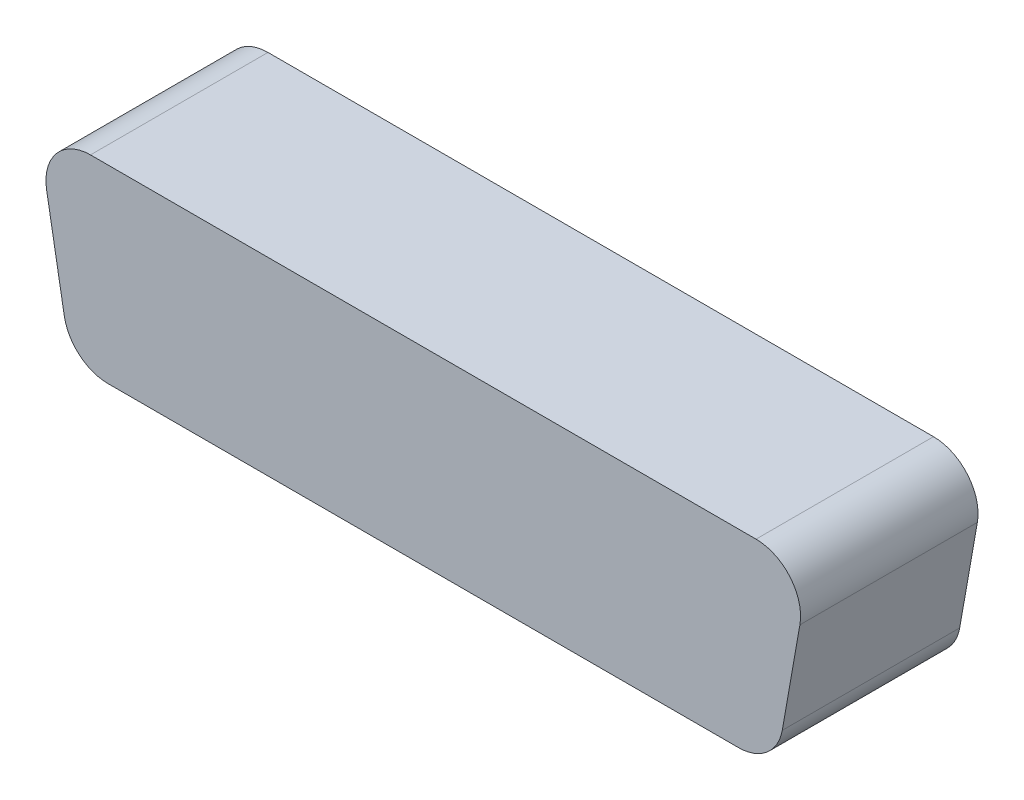
ISO-10303-21;
HEADER;
FILE_DESCRIPTION(('STEP AP214'),'2;1');
FILE_NAME('part.step','',(''),(''),'','','');
FILE_SCHEMA(('AUTOMOTIVE_DESIGN { 1 0 10303 214 1 1 1 1 }'));
ENDSEC;
DATA;
#1=APPLICATION_CONTEXT('core data for automotive mechanical design processes');
#2=APPLICATION_PROTOCOL_DEFINITION('international standard','automotive_design',2000,#1);
#3=PRODUCT_CONTEXT('',#1,'mechanical');
#4=PRODUCT('Part','Part','',(#3));
#5=PRODUCT_RELATED_PRODUCT_CATEGORY('part','',(#4));
#6=PRODUCT_DEFINITION_FORMATION('','',#4);
#7=PRODUCT_DEFINITION_CONTEXT('part definition',#1,'design');
#8=PRODUCT_DEFINITION('design','',#6,#7);
#9=PRODUCT_DEFINITION_SHAPE('','',#8);
#10=(LENGTH_UNIT() NAMED_UNIT(*) SI_UNIT(.MILLI.,.METRE.));
#11=(NAMED_UNIT(*) PLANE_ANGLE_UNIT() SI_UNIT($,.RADIAN.));
#12=(NAMED_UNIT(*) SI_UNIT($,.STERADIAN.) SOLID_ANGLE_UNIT());
#13=UNCERTAINTY_MEASURE_WITH_UNIT(LENGTH_MEASURE(1.E-05),#10,'distance_accuracy_value','');
#14=(GEOMETRIC_REPRESENTATION_CONTEXT(3) GLOBAL_UNCERTAINTY_ASSIGNED_CONTEXT((#13)) GLOBAL_UNIT_ASSIGNED_CONTEXT((#10,
#11,#12)) REPRESENTATION_CONTEXT('',''));
#15=CARTESIAN_POINT('',(0.,0.,0.));
#16=DIRECTION('',(0.,0.,1.));
#17=DIRECTION('',(1.,0.,0.));
#18=AXIS2_PLACEMENT_3D('',#15,#16,#17);
#19=CARTESIAN_POINT('',(-18.7504947870414,8.158,10.));
#20=DIRECTION('',(0.,0.,-1.));
#21=DIRECTION('',(-1.,0.,0.));
#22=AXIS2_PLACEMENT_3D('',#19,#20,#21);
#23=CYLINDRICAL_SURFACE('',#22,2.51);
#24=CARTESIAN_POINT('',(-18.7504947870414,8.158,0.));
#25=DIRECTION('',(0.,0.,1.));
#26=DIRECTION('',(1.,0.,0.));
#27=AXIS2_PLACEMENT_3D('',#24,#25,#26);
#28=CIRCLE('',#27,2.51);
#29=CARTESIAN_POINT('',(-18.7504947870414,10.668,0.));
#30=VERTEX_POINT('',#29);
#31=CARTESIAN_POINT('',(-21.222362247102,7.72214307405601,0.));
#32=VERTEX_POINT('',#31);
#33=EDGE_CURVE('E131',#30,#32,#28,.T.);
#34=ORIENTED_EDGE('',*,*,#33,.T.);
#35=DIRECTION('',(0.,0.,-1.));
#36=VECTOR('',#35,1.);
#37=CARTESIAN_POINT('',(-21.222362247102,7.72214307405601,10.));
#38=LINE('',#37,#36);
#39=CARTESIAN_POINT('',(-21.222362247102,7.72214307405601,10.));
#40=VERTEX_POINT('',#39);
#41=EDGE_CURVE('E11',#40,#32,#38,.T.);
#42=ORIENTED_EDGE('',*,*,#41,.F.);
#43=CARTESIAN_POINT('',(-18.7504947870414,8.158,10.));
#44=DIRECTION('',(0.,0.,1.));
#45=DIRECTION('',(1.,0.,0.));
#46=AXIS2_PLACEMENT_3D('',#43,#44,#45);
#47=CIRCLE('',#46,2.51);
#48=CARTESIAN_POINT('',(-18.7504947870414,10.668,10.));
#49=VERTEX_POINT('',#48);
#50=EDGE_CURVE('E145',#49,#40,#47,.T.);
#51=ORIENTED_EDGE('',*,*,#50,.F.);
#52=DIRECTION('',(0.,0.,-1.));
#53=VECTOR('',#52,1.);
#54=CARTESIAN_POINT('',(-18.7504947870414,10.668,10.));
#55=LINE('',#54,#53);
#56=EDGE_CURVE('E127',#49,#30,#55,.T.);
#57=ORIENTED_EDGE('',*,*,#56,.T.);
#58=EDGE_LOOP('',(#34,#42,#51,#57));
#59=FACE_BOUND('',#58,.T.);
#60=ADVANCED_FACE('F35',(#59),#23,.T.);
#61=CARTESIAN_POINT('',(-20.2264674600606,2.07414307405601,10.));
#62=DIRECTION('',(0.984807753012209,0.173648177666927,0.));
#63=DIRECTION('',(-0.173648177666927,0.984807753012209,0.));
#64=AXIS2_PLACEMENT_3D('',#61,#62,#63);
#65=PLANE('',#64);
#66=DIRECTION('',(0.173648177666927,-0.984807753012209,0.));
#67=VECTOR('',#66,1.);
#68=CARTESIAN_POINT('',(-20.2264674600606,2.07414307405601,0.));
#69=LINE('',#68,#67);
#70=CARTESIAN_POINT('',(-20.2264674600606,2.07414307405601,0.));
#71=VERTEX_POINT('',#70);
#72=EDGE_CURVE('E134',#32,#71,#69,.T.);
#73=ORIENTED_EDGE('',*,*,#72,.T.);
#74=DIRECTION('',(0.,0.,-1.));
#75=VECTOR('',#74,1.);
#76=CARTESIAN_POINT('',(-20.2264674600606,2.07414307405601,10.));
#77=LINE('',#76,#75);
#78=CARTESIAN_POINT('',(-20.2264674600606,2.07414307405601,10.));
#79=VERTEX_POINT('',#78);
#80=EDGE_CURVE('E43',#79,#71,#77,.T.);
#81=ORIENTED_EDGE('',*,*,#80,.F.);
#82=DIRECTION('',(0.173648177666927,-0.984807753012209,0.));
#83=VECTOR('',#82,1.);
#84=CARTESIAN_POINT('',(-20.2264674600606,2.07414307405601,10.));
#85=LINE('',#84,#83);
#86=EDGE_CURVE('E94',#40,#79,#85,.T.);
#87=ORIENTED_EDGE('',*,*,#86,.F.);
#88=ORIENTED_EDGE('',*,*,#41,.T.);
#89=EDGE_LOOP('',(#73,#81,#87,#88));
#90=FACE_BOUND('',#89,.T.);
#91=ADVANCED_FACE('F180',(#90),#65,.F.);
#92=CARTESIAN_POINT('',(-17.7546,2.51,10.));
#93=DIRECTION('',(0.,0.,-1.));
#94=DIRECTION('',(-1.,0.,0.));
#95=AXIS2_PLACEMENT_3D('',#92,#93,#94);
#96=CYLINDRICAL_SURFACE('',#95,2.51);
#97=CARTESIAN_POINT('',(-17.7546,2.51,0.));
#98=DIRECTION('',(0.,0.,1.));
#99=DIRECTION('',(1.,0.,0.));
#100=AXIS2_PLACEMENT_3D('',#97,#98,#99);
#101=CIRCLE('',#100,2.51);
#102=CARTESIAN_POINT('',(-17.7546,0.,0.));
#103=VERTEX_POINT('',#102);
#104=EDGE_CURVE('E136',#71,#103,#101,.T.);
#105=ORIENTED_EDGE('',*,*,#104,.T.);
#106=DIRECTION('',(0.,0.,-1.));
#107=VECTOR('',#106,1.);
#108=CARTESIAN_POINT('',(-17.7546,0.,10.));
#109=LINE('',#108,#107);
#110=CARTESIAN_POINT('',(-17.7546,0.,10.));
#111=VERTEX_POINT('',#110);
#112=EDGE_CURVE('E152',#111,#103,#109,.T.);
#113=ORIENTED_EDGE('',*,*,#112,.F.);
#114=CARTESIAN_POINT('',(-17.7546,2.51,10.));
#115=DIRECTION('',(0.,0.,1.));
#116=DIRECTION('',(1.,0.,0.));
#117=AXIS2_PLACEMENT_3D('',#114,#115,#116);
#118=CIRCLE('',#117,2.51);
#119=EDGE_CURVE('E160',#79,#111,#118,.T.);
#120=ORIENTED_EDGE('',*,*,#119,.F.);
#121=ORIENTED_EDGE('',*,*,#80,.T.);
#122=EDGE_LOOP('',(#105,#113,#120,#121));
#123=FACE_BOUND('',#122,.T.);
#124=ADVANCED_FACE('F158',(#123),#96,.T.);
#125=CARTESIAN_POINT('',(17.7546,0.,10.));
#126=DIRECTION('',(0.,1.,0.));
#127=DIRECTION('',(0.,0.,1.));
#128=AXIS2_PLACEMENT_3D('',#125,#126,#127);
#129=PLANE('',#128);
#130=DIRECTION('',(1.,0.,0.));
#131=VECTOR('',#130,1.);
#132=CARTESIAN_POINT('',(17.7546,0.,0.));
#133=LINE('',#132,#131);
#134=CARTESIAN_POINT('',(17.7546,0.,0.));
#135=VERTEX_POINT('',#134);
#136=EDGE_CURVE('E138',#103,#135,#133,.T.);
#137=ORIENTED_EDGE('',*,*,#136,.T.);
#138=DIRECTION('',(0.,0.,-1.));
#139=VECTOR('',#138,1.);
#140=CARTESIAN_POINT('',(17.7546,0.,10.));
#141=LINE('',#140,#139);
#142=CARTESIAN_POINT('',(17.7546,0.,10.));
#143=VERTEX_POINT('',#142);
#144=EDGE_CURVE('E149',#143,#135,#141,.T.);
#145=ORIENTED_EDGE('',*,*,#144,.F.);
#146=DIRECTION('',(1.,0.,0.));
#147=VECTOR('',#146,1.);
#148=CARTESIAN_POINT('',(17.7546,0.,10.));
#149=LINE('',#148,#147);
#150=EDGE_CURVE('E172',#111,#143,#149,.T.);
#151=ORIENTED_EDGE('',*,*,#150,.F.);
#152=ORIENTED_EDGE('',*,*,#112,.T.);
#153=EDGE_LOOP('',(#137,#145,#151,#152));
#154=FACE_BOUND('',#153,.T.);
#155=ADVANCED_FACE('F168',(#154),#129,.F.);
#156=CARTESIAN_POINT('',(17.7546,2.51,10.));
#157=DIRECTION('',(0.,0.,-1.));
#158=DIRECTION('',(-1.,0.,0.));
#159=AXIS2_PLACEMENT_3D('',#156,#157,#158);
#160=CYLINDRICAL_SURFACE('',#159,2.51);
#161=CARTESIAN_POINT('',(17.7546,2.51,0.));
#162=DIRECTION('',(0.,0.,1.));
#163=DIRECTION('',(1.,0.,0.));
#164=AXIS2_PLACEMENT_3D('',#161,#162,#163);
#165=CIRCLE('',#164,2.51);
#166=CARTESIAN_POINT('',(20.2264674600606,2.07414307405601,0.));
#167=VERTEX_POINT('',#166);
#168=EDGE_CURVE('E140',#135,#167,#165,.T.);
#169=ORIENTED_EDGE('',*,*,#168,.T.);
#170=DIRECTION('',(0.,0.,-1.));
#171=VECTOR('',#170,1.);
#172=CARTESIAN_POINT('',(20.2264674600606,2.07414307405601,10.));
#173=LINE('',#172,#171);
#174=CARTESIAN_POINT('',(20.2264674600606,2.07414307405601,10.));
#175=VERTEX_POINT('',#174);
#176=EDGE_CURVE('E122',#175,#167,#173,.T.);
#177=ORIENTED_EDGE('',*,*,#176,.F.);
#178=CARTESIAN_POINT('',(17.7546,2.51,10.));
#179=DIRECTION('',(0.,0.,1.));
#180=DIRECTION('',(1.,0.,0.));
#181=AXIS2_PLACEMENT_3D('',#178,#179,#180);
#182=CIRCLE('',#181,2.51);
#183=EDGE_CURVE('E113',#143,#175,#182,.T.);
#184=ORIENTED_EDGE('',*,*,#183,.F.);
#185=ORIENTED_EDGE('',*,*,#144,.T.);
#186=EDGE_LOOP('',(#169,#177,#184,#185));
#187=FACE_BOUND('',#186,.T.);
#188=ADVANCED_FACE('F171',(#187),#160,.T.);
#189=CARTESIAN_POINT('',(21.222362247102,7.72214307405601,10.));
#190=DIRECTION('',(-0.984807753012209,0.173648177666927,0.));
#191=DIRECTION('',(-0.173648177666927,-0.984807753012209,0.));
#192=AXIS2_PLACEMENT_3D('',#189,#190,#191);
#193=PLANE('',#192);
#194=DIRECTION('',(0.173648177666927,0.984807753012209,0.));
#195=VECTOR('',#194,1.);
#196=CARTESIAN_POINT('',(21.222362247102,7.72214307405601,0.));
#197=LINE('',#196,#195);
#198=CARTESIAN_POINT('',(21.222362247102,7.72214307405601,0.));
#199=VERTEX_POINT('',#198);
#200=EDGE_CURVE('E121',#167,#199,#197,.T.);
#201=ORIENTED_EDGE('',*,*,#200,.T.);
#202=DIRECTION('',(0.,0.,-1.));
#203=VECTOR('',#202,1.);
#204=CARTESIAN_POINT('',(21.222362247102,7.72214307405601,10.));
#205=LINE('',#204,#203);
#206=CARTESIAN_POINT('',(21.222362247102,7.72214307405601,10.));
#207=VERTEX_POINT('',#206);
#208=EDGE_CURVE('E118',#207,#199,#205,.T.);
#209=ORIENTED_EDGE('',*,*,#208,.F.);
#210=DIRECTION('',(0.173648177666927,0.984807753012209,0.));
#211=VECTOR('',#210,1.);
#212=CARTESIAN_POINT('',(21.222362247102,7.72214307405601,10.));
#213=LINE('',#212,#211);
#214=EDGE_CURVE('E107',#175,#207,#213,.T.);
#215=ORIENTED_EDGE('',*,*,#214,.F.);
#216=ORIENTED_EDGE('',*,*,#176,.T.);
#217=EDGE_LOOP('',(#201,#209,#215,#216));
#218=FACE_BOUND('',#217,.T.);
#219=ADVANCED_FACE('F119',(#218),#193,.F.);
#220=CARTESIAN_POINT('',(18.7504947870414,8.158,10.));
#221=DIRECTION('',(0.,0.,-1.));
#222=DIRECTION('',(-1.,0.,0.));
#223=AXIS2_PLACEMENT_3D('',#220,#221,#222);
#224=CYLINDRICAL_SURFACE('',#223,2.51);
#225=CARTESIAN_POINT('',(18.7504947870414,8.158,0.));
#226=DIRECTION('',(0.,0.,1.));
#227=DIRECTION('',(1.,0.,0.));
#228=AXIS2_PLACEMENT_3D('',#225,#226,#227);
#229=CIRCLE('',#228,2.51);
#230=CARTESIAN_POINT('',(18.7504947870414,10.668,0.));
#231=VERTEX_POINT('',#230);
#232=EDGE_CURVE('E80',#199,#231,#229,.T.);
#233=ORIENTED_EDGE('',*,*,#232,.T.);
#234=DIRECTION('',(0.,0.,-1.));
#235=VECTOR('',#234,1.);
#236=CARTESIAN_POINT('',(18.7504947870414,10.668,10.));
#237=LINE('',#236,#235);
#238=CARTESIAN_POINT('',(18.7504947870414,10.668,10.));
#239=VERTEX_POINT('',#238);
#240=EDGE_CURVE('E123',#239,#231,#237,.T.);
#241=ORIENTED_EDGE('',*,*,#240,.F.);
#242=CARTESIAN_POINT('',(18.7504947870414,8.158,10.));
#243=DIRECTION('',(0.,0.,1.));
#244=DIRECTION('',(1.,0.,0.));
#245=AXIS2_PLACEMENT_3D('',#242,#243,#244);
#246=CIRCLE('',#245,2.51);
#247=EDGE_CURVE('E111',#207,#239,#246,.T.);
#248=ORIENTED_EDGE('',*,*,#247,.F.);
#249=ORIENTED_EDGE('',*,*,#208,.T.);
#250=EDGE_LOOP('',(#233,#241,#248,#249));
#251=FACE_BOUND('',#250,.T.);
#252=ADVANCED_FACE('F125',(#251),#224,.T.);
#253=CARTESIAN_POINT('',(-18.7504947870414,10.668,10.));
#254=DIRECTION('',(0.,-1.,0.));
#255=DIRECTION('',(1.,0.,0.));
#256=AXIS2_PLACEMENT_3D('',#253,#254,#255);
#257=PLANE('',#256);
#258=DIRECTION('',(-1.,0.,0.));
#259=VECTOR('',#258,1.);
#260=CARTESIAN_POINT('',(-18.7504947870414,10.668,0.));
#261=LINE('',#260,#259);
#262=EDGE_CURVE('E86',#231,#30,#261,.T.);
#263=ORIENTED_EDGE('',*,*,#262,.T.);
#264=ORIENTED_EDGE('',*,*,#56,.F.);
#265=DIRECTION('',(-1.,0.,0.));
#266=VECTOR('',#265,1.);
#267=CARTESIAN_POINT('',(-18.7504947870414,10.668,10.));
#268=LINE('',#267,#266);
#269=EDGE_CURVE('E51',#239,#49,#268,.T.);
#270=ORIENTED_EDGE('',*,*,#269,.F.);
#271=ORIENTED_EDGE('',*,*,#240,.T.);
#272=EDGE_LOOP('',(#263,#264,#270,#271));
#273=FACE_BOUND('',#272,.T.);
#274=ADVANCED_FACE('F196',(#273),#257,.F.);
#275=CARTESIAN_POINT('',(-18.7504947870414,8.158,10.));
#276=DIRECTION('',(0.,0.,1.));
#277=DIRECTION('',(1.,0.,0.));
#278=AXIS2_PLACEMENT_3D('',#275,#276,#277);
#279=PLANE('',#278);
#280=ORIENTED_EDGE('',*,*,#50,.T.);
#281=ORIENTED_EDGE('',*,*,#86,.T.);
#282=ORIENTED_EDGE('',*,*,#119,.T.);
#283=ORIENTED_EDGE('',*,*,#150,.T.);
#284=ORIENTED_EDGE('',*,*,#183,.T.);
#285=ORIENTED_EDGE('',*,*,#214,.T.);
#286=ORIENTED_EDGE('',*,*,#247,.T.);
#287=ORIENTED_EDGE('',*,*,#269,.T.);
#288=EDGE_LOOP('',(#280,#281,#282,#283,#284,#285,#286,#287));
#289=FACE_BOUND('',#288,.T.);
#290=ADVANCED_FACE('F109',(#289),#279,.T.);
#291=CARTESIAN_POINT('',(-18.7504947870414,8.158,0.));
#292=DIRECTION('',(0.,0.,1.));
#293=DIRECTION('',(1.,0.,0.));
#294=AXIS2_PLACEMENT_3D('',#291,#292,#293);
#295=PLANE('',#294);
#296=ORIENTED_EDGE('',*,*,#33,.F.);
#297=ORIENTED_EDGE('',*,*,#262,.F.);
#298=ORIENTED_EDGE('',*,*,#232,.F.);
#299=ORIENTED_EDGE('',*,*,#200,.F.);
#300=ORIENTED_EDGE('',*,*,#168,.F.);
#301=ORIENTED_EDGE('',*,*,#136,.F.);
#302=ORIENTED_EDGE('',*,*,#104,.F.);
#303=ORIENTED_EDGE('',*,*,#72,.F.);
#304=EDGE_LOOP('',(#296,#297,#298,#299,#300,#301,#302,#303));
#305=FACE_BOUND('',#304,.T.);
#306=ADVANCED_FACE('F164',(#305),#295,.F.);
#307=CLOSED_SHELL('',(#60,#91,#124,#155,#188,#219,#252,#274,#290,#306));
#308=MANIFOLD_SOLID_BREP('B2',#307);
#309=ADVANCED_BREP_SHAPE_REPRESENTATION('',(#18,#308),#14);
#310=SHAPE_DEFINITION_REPRESENTATION(#9,#309);
ENDSEC;
END-ISO-10303-21;
